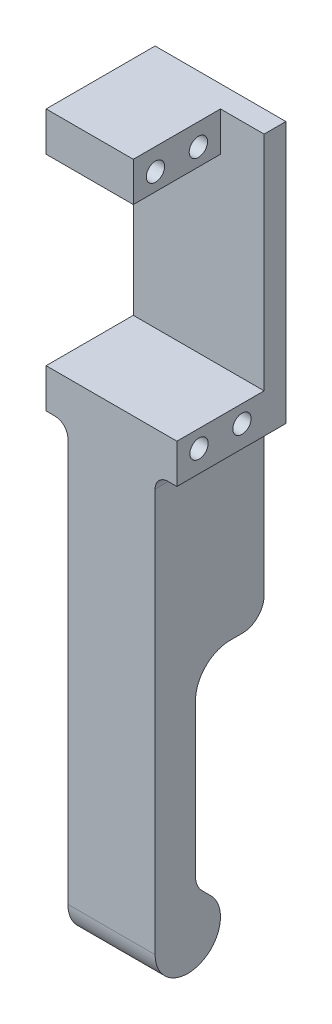
ISO-10303-21;
HEADER;
FILE_DESCRIPTION(('STEP AP214'),'2;1');
FILE_NAME('part.step','',(''),(''),'','','');
FILE_SCHEMA(('AUTOMOTIVE_DESIGN { 1 0 10303 214 1 1 1 1 }'));
ENDSEC;
DATA;
#1=APPLICATION_CONTEXT('core data for automotive mechanical design processes');
#2=APPLICATION_PROTOCOL_DEFINITION('international standard','automotive_design',2000,#1);
#3=PRODUCT_CONTEXT('',#1,'mechanical');
#4=PRODUCT('Part','Part','',(#3));
#5=PRODUCT_RELATED_PRODUCT_CATEGORY('part','',(#4));
#6=PRODUCT_DEFINITION_FORMATION('','',#4);
#7=PRODUCT_DEFINITION_CONTEXT('part definition',#1,'design');
#8=PRODUCT_DEFINITION('design','',#6,#7);
#9=PRODUCT_DEFINITION_SHAPE('','',#8);
#10=(LENGTH_UNIT() NAMED_UNIT(*) SI_UNIT(.MILLI.,.METRE.));
#11=(NAMED_UNIT(*) PLANE_ANGLE_UNIT() SI_UNIT($,.RADIAN.));
#12=(NAMED_UNIT(*) SI_UNIT($,.STERADIAN.) SOLID_ANGLE_UNIT());
#13=UNCERTAINTY_MEASURE_WITH_UNIT(LENGTH_MEASURE(1.E-05),#10,'distance_accuracy_value','');
#14=(GEOMETRIC_REPRESENTATION_CONTEXT(3) GLOBAL_UNCERTAINTY_ASSIGNED_CONTEXT((#13)) GLOBAL_UNIT_ASSIGNED_CONTEXT((#10,
#11,#12)) REPRESENTATION_CONTEXT('',''));
#15=CARTESIAN_POINT('',(0.,0.,0.));
#16=DIRECTION('',(0.,0.,1.));
#17=DIRECTION('',(1.,0.,0.));
#18=AXIS2_PLACEMENT_3D('',#15,#16,#17);
#19=CARTESIAN_POINT('',(-13.,-33.,25.0000000000009));
#20=DIRECTION('',(0.,0.,-1.));
#21=DIRECTION('',(-1.,0.,0.));
#22=AXIS2_PLACEMENT_3D('',#19,#20,#21);
#23=PLANE('',#22);
#24=DIRECTION('',(0.,-1.,0.));
#25=VECTOR('',#24,1.);
#26=CARTESIAN_POINT('',(-15.,30.,25.));
#27=LINE('',#26,#25);
#28=CARTESIAN_POINT('',(-15.,30.,25.));
#29=VERTEX_POINT('',#28);
#30=CARTESIAN_POINT('',(-14.9999999999998,21.,25.0000000000009));
#31=VERTEX_POINT('',#30);
#32=EDGE_CURVE('E446',#29,#31,#27,.T.);
#33=ORIENTED_EDGE('',*,*,#32,.T.);
#34=DIRECTION('',(-1.,0.,0.));
#35=VECTOR('',#34,1.);
#36=CARTESIAN_POINT('',(5.00000000000021,20.9999999999998,25.));
#37=LINE('',#36,#35);
#38=CARTESIAN_POINT('',(5.00000000000021,20.9999999999998,25.));
#39=VERTEX_POINT('',#38);
#40=EDGE_CURVE('E404',#39,#31,#37,.T.);
#41=ORIENTED_EDGE('',*,*,#40,.F.);
#42=DIRECTION('',(0.,-1.,0.));
#43=VECTOR('',#42,1.);
#44=CARTESIAN_POINT('',(4.99999999999999,29.9999999999998,25.0000000000009));
#45=LINE('',#44,#43);
#46=CARTESIAN_POINT('',(4.99999999999999,29.9999999999998,25.0000000000009));
#47=VERTEX_POINT('',#46);
#48=EDGE_CURVE('E425',#47,#39,#45,.T.);
#49=ORIENTED_EDGE('',*,*,#48,.F.);
#50=DIRECTION('',(-1.,0.,0.));
#51=VECTOR('',#50,1.);
#52=CARTESIAN_POINT('',(-15.,30.,25.));
#53=LINE('',#52,#51);
#54=EDGE_CURVE('E248',#47,#29,#53,.T.);
#55=ORIENTED_EDGE('',*,*,#54,.T.);
#56=EDGE_LOOP('',(#33,#41,#49,#55));
#57=FACE_BOUND('',#56,.T.);
#58=ADVANCED_FACE('F53',(#57),#23,.F.);
#59=CARTESIAN_POINT('',(-15.,30.,25.));
#60=DIRECTION('',(1.,0.,0.));
#61=DIRECTION('',(0.,1.,0.));
#62=AXIS2_PLACEMENT_3D('',#59,#60,#61);
#63=PLANE('',#62);
#64=CARTESIAN_POINT('',(-15.,-25.0000000000005,10.0749999999998));
#65=DIRECTION('',(-1.,0.,0.));
#66=DIRECTION('',(0.,1.,0.));
#67=AXIS2_PLACEMENT_3D('',#64,#65,#66);
#68=CIRCLE('',#67,2.1);
#69=CARTESIAN_POINT('',(-15.,-22.9000000000005,10.0749999999998));
#70=VERTEX_POINT('',#69);
#71=EDGE_CURVE('E376',#70,#70,#68,.T.);
#72=ORIENTED_EDGE('',*,*,#71,.F.);
#73=EDGE_LOOP('',(#72));
#74=FACE_BOUND('',#73,.T.);
#75=CARTESIAN_POINT('',(-15.,-25.0000000000001,19.9249999999999));
#76=DIRECTION('',(-1.,0.,0.));
#77=DIRECTION('',(0.,1.,0.));
#78=AXIS2_PLACEMENT_3D('',#75,#76,#77);
#79=CIRCLE('',#78,2.1);
#80=CARTESIAN_POINT('',(-15.,-22.9000000000001,19.9249999999999));
#81=VERTEX_POINT('',#80);
#82=EDGE_CURVE('E385',#81,#81,#79,.T.);
#83=ORIENTED_EDGE('',*,*,#82,.F.);
#84=EDGE_LOOP('',(#83));
#85=FACE_BOUND('',#84,.T.);
#86=CARTESIAN_POINT('',(-15.,25.,19.925));
#87=DIRECTION('',(-1.,0.,0.));
#88=DIRECTION('',(0.,-1.,0.));
#89=AXIS2_PLACEMENT_3D('',#86,#87,#88);
#90=CIRCLE('',#89,2.1);
#91=CARTESIAN_POINT('',(-15.,22.9,19.925));
#92=VERTEX_POINT('',#91);
#93=EDGE_CURVE('E377',#92,#92,#90,.T.);
#94=ORIENTED_EDGE('',*,*,#93,.F.);
#95=EDGE_LOOP('',(#94));
#96=FACE_BOUND('',#95,.T.);
#97=CARTESIAN_POINT('',(-15.,25.,10.075));
#98=DIRECTION('',(-1.,0.,0.));
#99=DIRECTION('',(0.,-1.,0.));
#100=AXIS2_PLACEMENT_3D('',#97,#98,#99);
#101=CIRCLE('',#100,2.1);
#102=CARTESIAN_POINT('',(-15.,22.9,10.075));
#103=VERTEX_POINT('',#102);
#104=EDGE_CURVE('E317',#103,#103,#101,.T.);
#105=ORIENTED_EDGE('',*,*,#104,.F.);
#106=EDGE_LOOP('',(#105));
#107=FACE_BOUND('',#106,.T.);
#108=DIRECTION('',(0.,-1.,0.));
#109=VECTOR('',#108,1.);
#110=CARTESIAN_POINT('',(-14.9999999999998,21.,5.00000000000089));
#111=LINE('',#110,#109);
#112=CARTESIAN_POINT('',(-14.9999999999998,21.,5.00000000000089));
#113=VERTEX_POINT('',#112);
#114=CARTESIAN_POINT('',(-14.9999999999998,-21.,5.));
#115=VERTEX_POINT('',#114);
#116=EDGE_CURVE('E399',#113,#115,#111,.T.);
#117=ORIENTED_EDGE('',*,*,#116,.F.);
#118=DIRECTION('',(0.,0.,1.));
#119=VECTOR('',#118,1.);
#120=CARTESIAN_POINT('',(-14.9999999999998,21.,5.00000000000089));
#121=LINE('',#120,#119);
#122=EDGE_CURVE('E257',#113,#31,#121,.T.);
#123=ORIENTED_EDGE('',*,*,#122,.T.);
#124=ORIENTED_EDGE('',*,*,#32,.F.);
#125=DIRECTION('',(0.,0.,-1.));
#126=VECTOR('',#125,1.);
#127=CARTESIAN_POINT('',(-15.,30.,25.));
#128=LINE('',#127,#126);
#129=CARTESIAN_POINT('',(-15.,30.,0.));
#130=VERTEX_POINT('',#129);
#131=EDGE_CURVE('E251',#29,#130,#128,.T.);
#132=ORIENTED_EDGE('',*,*,#131,.T.);
#133=DIRECTION('',(0.,-1.,0.));
#134=VECTOR('',#133,1.);
#135=CARTESIAN_POINT('',(-15.,30.,0.));
#136=LINE('',#135,#134);
#137=CARTESIAN_POINT('',(-15.,-30.,0.));
#138=VERTEX_POINT('',#137);
#139=EDGE_CURVE('E252',#130,#138,#136,.T.);
#140=ORIENTED_EDGE('',*,*,#139,.T.);
#141=DIRECTION('',(0.,0.,-1.));
#142=VECTOR('',#141,1.);
#143=CARTESIAN_POINT('',(-14.9999999999998,-30.,25.));
#144=LINE('',#143,#142);
#145=CARTESIAN_POINT('',(-14.9999999999998,-30.,25.));
#146=VERTEX_POINT('',#145);
#147=EDGE_CURVE('E308',#146,#138,#144,.T.);
#148=ORIENTED_EDGE('',*,*,#147,.F.);
#149=CARTESIAN_POINT('',(-14.9999999999998,-21.,25.));
#150=VERTEX_POINT('',#149);
#151=EDGE_CURVE('E282',#150,#146,#27,.T.);
#152=ORIENTED_EDGE('',*,*,#151,.F.);
#153=DIRECTION('',(0.,0.,1.));
#154=VECTOR('',#153,1.);
#155=CARTESIAN_POINT('',(-14.9999999999998,-21.,5.));
#156=LINE('',#155,#154);
#157=EDGE_CURVE('E77',#115,#150,#156,.T.);
#158=ORIENTED_EDGE('',*,*,#157,.F.);
#159=EDGE_LOOP('',(#117,#123,#124,#132,#140,#148,#152,#158));
#160=FACE_BOUND('',#159,.T.);
#161=ADVANCED_FACE('F55',(#74,#85,#96,#107,#160),#63,.F.);
#162=CARTESIAN_POINT('',(-14.9999999999998,-30.,25.));
#163=DIRECTION('',(0.,1.,0.));
#164=DIRECTION('',(0.,0.,1.));
#165=AXIS2_PLACEMENT_3D('',#162,#163,#164);
#166=PLANE('',#165);
#167=DIRECTION('',(1.,0.,0.));
#168=VECTOR('',#167,1.);
#169=CARTESIAN_POINT('',(-15.,-30.,0.));
#170=LINE('',#169,#168);
#171=CARTESIAN_POINT('',(-13.,-30.,0.));
#172=VERTEX_POINT('',#171);
#173=EDGE_CURVE('E256',#138,#172,#170,.T.);
#174=ORIENTED_EDGE('',*,*,#173,.T.);
#175=DIRECTION('',(0.,0.,-1.));
#176=VECTOR('',#175,1.);
#177=CARTESIAN_POINT('',(-12.9999999999998,-30.0000000000004,25.));
#178=LINE('',#177,#176);
#179=CARTESIAN_POINT('',(-12.9999999999998,-30.0000000000004,25.));
#180=VERTEX_POINT('',#179);
#181=EDGE_CURVE('E304',#180,#172,#178,.T.);
#182=ORIENTED_EDGE('',*,*,#181,.F.);
#183=DIRECTION('',(1.,0.,0.));
#184=VECTOR('',#183,1.);
#185=CARTESIAN_POINT('',(-14.9999999999998,-30.,25.));
#186=LINE('',#185,#184);
#187=EDGE_CURVE('E235',#146,#180,#186,.T.);
#188=ORIENTED_EDGE('',*,*,#187,.F.);
#189=ORIENTED_EDGE('',*,*,#147,.T.);
#190=EDGE_LOOP('',(#174,#182,#188,#189));
#191=FACE_BOUND('',#190,.T.);
#192=ADVANCED_FACE('F456',(#191),#166,.F.);
#193=CARTESIAN_POINT('',(-13.,-33.,25.0000000000009));
#194=DIRECTION('',(0.,0.,-1.));
#195=DIRECTION('',(-1.,0.,0.));
#196=AXIS2_PLACEMENT_3D('',#193,#194,#195);
#197=CYLINDRICAL_SURFACE('',#196,3.);
#198=CARTESIAN_POINT('',(-13.,-33.,8.88178419700125E-13));
#199=DIRECTION('',(0.,0.,-1.));
#200=DIRECTION('',(-1.,0.,0.));
#201=AXIS2_PLACEMENT_3D('',#198,#199,#200);
#202=CIRCLE('',#201,3.);
#203=CARTESIAN_POINT('',(-9.99999999999999,-33.,8.88178419700125E-13));
#204=VERTEX_POINT('',#203);
#205=EDGE_CURVE('E260',#172,#204,#202,.T.);
#206=ORIENTED_EDGE('',*,*,#205,.T.);
#207=DIRECTION('',(0.,0.,-1.));
#208=VECTOR('',#207,1.);
#209=CARTESIAN_POINT('',(-9.99999999999999,-33.,25.0000000000009));
#210=LINE('',#209,#208);
#211=CARTESIAN_POINT('',(-9.99999999999999,-33.,25.0000000000009));
#212=VERTEX_POINT('',#211);
#213=EDGE_CURVE('E301',#212,#204,#210,.T.);
#214=ORIENTED_EDGE('',*,*,#213,.F.);
#215=CARTESIAN_POINT('',(-13.,-33.,25.0000000000009));
#216=DIRECTION('',(0.,0.,-1.));
#217=DIRECTION('',(-1.,0.,0.));
#218=AXIS2_PLACEMENT_3D('',#215,#216,#217);
#219=CIRCLE('',#218,3.);
#220=EDGE_CURVE('E225',#180,#212,#219,.T.);
#221=ORIENTED_EDGE('',*,*,#220,.F.);
#222=ORIENTED_EDGE('',*,*,#181,.T.);
#223=EDGE_LOOP('',(#206,#214,#221,#222));
#224=FACE_BOUND('',#223,.T.);
#225=ADVANCED_FACE('F459',(#224),#197,.F.);
#226=CARTESIAN_POINT('',(-9.99999999999977,-133.,25.));
#227=DIRECTION('',(1.,0.,0.));
#228=DIRECTION('',(0.,0.,-1.));
#229=AXIS2_PLACEMENT_3D('',#226,#227,#228);
#230=PLANE('',#229);
#231=DIRECTION('',(0.,-1.,0.));
#232=VECTOR('',#231,1.);
#233=CARTESIAN_POINT('',(-9.99999999999977,-133.000000000002,0.));
#234=LINE('',#233,#232);
#235=CARTESIAN_POINT('',(-9.99999999999999,-66.6611652351682,8.88178419700125E-13));
#236=VERTEX_POINT('',#235);
#237=EDGE_CURVE('E263',#204,#236,#234,.T.);
#238=ORIENTED_EDGE('',*,*,#237,.T.);
#239=CARTESIAN_POINT('',(-9.99999999999977,-66.6611652351682,5.00000000000078));
#240=DIRECTION('',(1.,0.,0.));
#241=DIRECTION('',(0.,0.,-1.));
#242=AXIS2_PLACEMENT_3D('',#239,#240,#241);
#243=CIRCLE('',#242,5.);
#244=CARTESIAN_POINT('',(-9.99999999999977,-71.6611652351682,5.00000000000084));
#245=VERTEX_POINT('',#244);
#246=EDGE_CURVE('E69',#245,#236,#243,.T.);
#247=ORIENTED_EDGE('',*,*,#246,.F.);
#248=DIRECTION('',(0.,0.,-1.));
#249=VECTOR('',#248,1.);
#250=CARTESIAN_POINT('',(-9.99999999999977,-71.6611652351682,5.00000000000084));
#251=LINE('',#250,#249);
#252=CARTESIAN_POINT('',(-9.99999999999999,-71.6611652351682,7.73223304703441));
#253=VERTEX_POINT('',#252);
#254=EDGE_CURVE('E499',#253,#245,#251,.T.);
#255=ORIENTED_EDGE('',*,*,#254,.F.);
#256=CARTESIAN_POINT('',(-9.99999999999999,-79.6611652351682,7.73223304703441));
#257=DIRECTION('',(-1.,0.,0.));
#258=DIRECTION('',(0.,0.,1.));
#259=AXIS2_PLACEMENT_3D('',#256,#257,#258);
#260=CIRCLE('',#259,8.);
#261=CARTESIAN_POINT('',(-9.99999999999999,-79.6611652351682,15.7322330470344));
#262=VERTEX_POINT('',#261);
#263=EDGE_CURVE('E494',#262,#253,#260,.T.);
#264=ORIENTED_EDGE('',*,*,#263,.F.);
#265=DIRECTION('',(0.,1.,0.));
#266=VECTOR('',#265,1.);
#267=CARTESIAN_POINT('',(-9.99999999999999,-79.6611652351682,15.7322330470344));
#268=LINE('',#267,#266);
#269=CARTESIAN_POINT('',(-10.,-114.590097423303,15.7322330470344));
#270=VERTEX_POINT('',#269);
#271=EDGE_CURVE('E352',#270,#262,#268,.T.);
#272=ORIENTED_EDGE('',*,*,#271,.F.);
#273=CARTESIAN_POINT('',(-9.99999999999999,-114.590097423303,10.7322330470344));
#274=DIRECTION('',(-1.,0.,0.));
#275=DIRECTION('',(0.,0.,1.));
#276=AXIS2_PLACEMENT_3D('',#273,#274,#275);
#277=CIRCLE('',#276,5.);
#278=CARTESIAN_POINT('',(-9.99999999999998,-118.125631329236,14.2677669529663));
#279=VERTEX_POINT('',#278);
#280=EDGE_CURVE('E490',#279,#270,#277,.T.);
#281=ORIENTED_EDGE('',*,*,#280,.F.);
#282=DIRECTION('',(0.,0.707106781186548,0.707106781186547));
#283=VECTOR('',#282,1.);
#284=CARTESIAN_POINT('',(-9.99999999999999,-120.196699141101,12.1966991411017));
#285=LINE('',#284,#283);
#286=CARTESIAN_POINT('',(-9.99999999999999,-120.196699141101,12.1966991411017));
#287=VERTEX_POINT('',#286);
#288=EDGE_CURVE('E207',#287,#279,#285,.T.);
#289=ORIENTED_EDGE('',*,*,#288,.F.);
#290=CARTESIAN_POINT('',(-9.99999999999999,-125.5,17.5));
#291=DIRECTION('',(1.,0.,0.));
#292=DIRECTION('',(0.,0.,1.));
#293=AXIS2_PLACEMENT_3D('',#290,#291,#292);
#294=CIRCLE('',#293,7.5);
#295=CARTESIAN_POINT('',(-9.99999999999977,-125.5,24.9999999999999));
#296=VERTEX_POINT('',#295);
#297=EDGE_CURVE('E198',#296,#287,#294,.T.);
#298=ORIENTED_EDGE('',*,*,#297,.F.);
#299=DIRECTION('',(0.,-1.,0.));
#300=VECTOR('',#299,1.);
#301=CARTESIAN_POINT('',(-9.99999999999977,-133.,25.));
#302=LINE('',#301,#300);
#303=EDGE_CURVE('E204',#212,#296,#302,.T.);
#304=ORIENTED_EDGE('',*,*,#303,.F.);
#305=ORIENTED_EDGE('',*,*,#213,.T.);
#306=EDGE_LOOP('',(#238,#247,#255,#264,#272,#281,#289,#298,#304,#305));
#307=FACE_BOUND('',#306,.T.);
#308=ADVANCED_FACE('F201',(#307),#230,.F.);
#309=CARTESIAN_POINT('',(9.99999999999999,-33.,25.));
#310=DIRECTION('',(-1.,0.,0.));
#311=DIRECTION('',(0.,-1.,0.));
#312=AXIS2_PLACEMENT_3D('',#309,#310,#311);
#313=PLANE('',#312);
#314=DIRECTION('',(0.,0.,-1.));
#315=VECTOR('',#314,1.);
#316=CARTESIAN_POINT('',(10.0000000000002,-71.6611652351682,25.));
#317=LINE('',#316,#315);
#318=CARTESIAN_POINT('',(10.,-71.6611652351682,7.73223304703352));
#319=VERTEX_POINT('',#318);
#320=CARTESIAN_POINT('',(10.0000000000002,-71.6611652351682,4.99999999999995));
#321=VERTEX_POINT('',#320);
#322=EDGE_CURVE('E13',#319,#321,#317,.T.);
#323=ORIENTED_EDGE('',*,*,#322,.T.);
#324=CARTESIAN_POINT('',(10.0000000000002,-66.6611652351682,4.99999999999989));
#325=DIRECTION('',(-1.,0.,0.));
#326=DIRECTION('',(0.,-1.,0.));
#327=AXIS2_PLACEMENT_3D('',#324,#325,#326);
#328=CIRCLE('',#327,5.);
#329=CARTESIAN_POINT('',(10.,-66.6611652351682,-1.11022302462516E-13));
#330=VERTEX_POINT('',#329);
#331=EDGE_CURVE('E371',#321,#330,#328,.F.);
#332=ORIENTED_EDGE('',*,*,#331,.T.);
#333=DIRECTION('',(0.,1.,0.));
#334=VECTOR('',#333,1.);
#335=CARTESIAN_POINT('',(9.99999999999999,-33.,0.));
#336=LINE('',#335,#334);
#337=CARTESIAN_POINT('',(9.99999999999998,-33.,0.));
#338=VERTEX_POINT('',#337);
#339=EDGE_CURVE('E266',#330,#338,#336,.T.);
#340=ORIENTED_EDGE('',*,*,#339,.T.);
#341=DIRECTION('',(0.,0.,-1.));
#342=VECTOR('',#341,1.);
#343=CARTESIAN_POINT('',(9.99999999999999,-33.,25.));
#344=LINE('',#343,#342);
#345=CARTESIAN_POINT('',(9.99999999999999,-33.,25.));
#346=VERTEX_POINT('',#345);
#347=EDGE_CURVE('E297',#346,#338,#344,.T.);
#348=ORIENTED_EDGE('',*,*,#347,.F.);
#349=DIRECTION('',(0.,1.,0.));
#350=VECTOR('',#349,1.);
#351=CARTESIAN_POINT('',(10.0000000000002,-61.,25.));
#352=LINE('',#351,#350);
#353=CARTESIAN_POINT('',(10.0000000000002,-125.5,24.9999999999999));
#354=VERTEX_POINT('',#353);
#355=EDGE_CURVE('E228',#354,#346,#352,.T.);
#356=ORIENTED_EDGE('',*,*,#355,.F.);
#357=CARTESIAN_POINT('',(10.,-125.5,17.5));
#358=DIRECTION('',(-1.,0.,0.));
#359=DIRECTION('',(0.,-1.,0.));
#360=AXIS2_PLACEMENT_3D('',#357,#358,#359);
#361=CIRCLE('',#360,7.5);
#362=CARTESIAN_POINT('',(10.,-120.196699141101,12.1966991411008));
#363=VERTEX_POINT('',#362);
#364=EDGE_CURVE('E216',#354,#363,#361,.F.);
#365=ORIENTED_EDGE('',*,*,#364,.T.);
#366=DIRECTION('',(0.,0.707106781186548,0.707106781186547));
#367=VECTOR('',#366,1.);
#368=CARTESIAN_POINT('',(10.0000000000002,-70.1966991411008,62.1966991411024));
#369=LINE('',#368,#367);
#370=CARTESIAN_POINT('',(10.,-118.125631329235,14.2677669529663));
#371=VERTEX_POINT('',#370);
#372=EDGE_CURVE('E220',#363,#371,#369,.T.);
#373=ORIENTED_EDGE('',*,*,#372,.T.);
#374=CARTESIAN_POINT('',(10.,-114.590097423303,10.7322330470335));
#375=DIRECTION('',(-1.,0.,0.));
#376=DIRECTION('',(0.,-1.,0.));
#377=AXIS2_PLACEMENT_3D('',#374,#375,#376);
#378=CIRCLE('',#377,5.);
#379=CARTESIAN_POINT('',(10.,-114.590097423303,15.7322330470335));
#380=VERTEX_POINT('',#379);
#381=EDGE_CURVE('E327',#371,#380,#378,.T.);
#382=ORIENTED_EDGE('',*,*,#381,.T.);
#383=DIRECTION('',(0.,1.,0.));
#384=VECTOR('',#383,1.);
#385=CARTESIAN_POINT('',(9.99999999999999,-33.0000000000004,15.7322330470335));
#386=LINE('',#385,#384);
#387=CARTESIAN_POINT('',(10.,-79.6611652351682,15.7322330470335));
#388=VERTEX_POINT('',#387);
#389=EDGE_CURVE('E331',#380,#388,#386,.T.);
#390=ORIENTED_EDGE('',*,*,#389,.T.);
#391=CARTESIAN_POINT('',(10.,-79.6611652351682,7.73223304703352));
#392=DIRECTION('',(-1.,0.,0.));
#393=DIRECTION('',(0.,-1.,0.));
#394=AXIS2_PLACEMENT_3D('',#391,#392,#393);
#395=CIRCLE('',#394,8.);
#396=EDGE_CURVE('E62',#388,#319,#395,.T.);
#397=ORIENTED_EDGE('',*,*,#396,.T.);
#398=EDGE_LOOP('',(#323,#332,#340,#348,#356,#365,#373,#382,#390,#397));
#399=FACE_BOUND('',#398,.T.);
#400=ADVANCED_FACE('F338',(#399),#313,.F.);
#401=CARTESIAN_POINT('',(13.,-33.,25.));
#402=DIRECTION('',(0.,0.,-1.));
#403=DIRECTION('',(-1.,0.,0.));
#404=AXIS2_PLACEMENT_3D('',#401,#402,#403);
#405=CYLINDRICAL_SURFACE('',#404,3.);
#406=CARTESIAN_POINT('',(13.,-33.,8.88178419700125E-13));
#407=DIRECTION('',(0.,0.,-1.));
#408=DIRECTION('',(1.,0.,0.));
#409=AXIS2_PLACEMENT_3D('',#406,#407,#408);
#410=CIRCLE('',#409,3.);
#411=CARTESIAN_POINT('',(13.,-30.,0.));
#412=VERTEX_POINT('',#411);
#413=EDGE_CURVE('E269',#338,#412,#410,.T.);
#414=ORIENTED_EDGE('',*,*,#413,.T.);
#415=DIRECTION('',(0.,0.,-1.));
#416=VECTOR('',#415,1.);
#417=CARTESIAN_POINT('',(13.0000000000002,-30.,25.));
#418=LINE('',#417,#416);
#419=CARTESIAN_POINT('',(13.0000000000002,-30.,25.));
#420=VERTEX_POINT('',#419);
#421=EDGE_CURVE('E293',#420,#412,#418,.T.);
#422=ORIENTED_EDGE('',*,*,#421,.F.);
#423=CARTESIAN_POINT('',(13.,-33.,25.));
#424=DIRECTION('',(0.,0.,-1.));
#425=DIRECTION('',(1.,0.,0.));
#426=AXIS2_PLACEMENT_3D('',#423,#424,#425);
#427=CIRCLE('',#426,3.);
#428=EDGE_CURVE('E233',#346,#420,#427,.T.);
#429=ORIENTED_EDGE('',*,*,#428,.F.);
#430=ORIENTED_EDGE('',*,*,#347,.T.);
#431=EDGE_LOOP('',(#414,#422,#429,#430));
#432=FACE_BOUND('',#431,.T.);
#433=ADVANCED_FACE('F470',(#432),#405,.F.);
#434=CARTESIAN_POINT('',(15.0000000000002,-30.,25.0000000000009));
#435=DIRECTION('',(0.,1.,0.));
#436=DIRECTION('',(0.,0.,1.));
#437=AXIS2_PLACEMENT_3D('',#434,#435,#436);
#438=PLANE('',#437);
#439=DIRECTION('',(1.,0.,0.));
#440=VECTOR('',#439,1.);
#441=CARTESIAN_POINT('',(15.,-30.,8.88178419700125E-13));
#442=LINE('',#441,#440);
#443=CARTESIAN_POINT('',(15.,-30.,8.88178419700125E-13));
#444=VERTEX_POINT('',#443);
#445=EDGE_CURVE('E272',#412,#444,#442,.T.);
#446=ORIENTED_EDGE('',*,*,#445,.T.);
#447=DIRECTION('',(0.,0.,-1.));
#448=VECTOR('',#447,1.);
#449=CARTESIAN_POINT('',(15.0000000000002,-30.,25.0000000000009));
#450=LINE('',#449,#448);
#451=CARTESIAN_POINT('',(15.0000000000002,-30.,25.0000000000009));
#452=VERTEX_POINT('',#451);
#453=EDGE_CURVE('E289',#452,#444,#450,.T.);
#454=ORIENTED_EDGE('',*,*,#453,.F.);
#455=DIRECTION('',(1.,0.,0.));
#456=VECTOR('',#455,1.);
#457=CARTESIAN_POINT('',(15.0000000000002,-30.,25.0000000000009));
#458=LINE('',#457,#456);
#459=EDGE_CURVE('E241',#420,#452,#458,.T.);
#460=ORIENTED_EDGE('',*,*,#459,.F.);
#461=ORIENTED_EDGE('',*,*,#421,.T.);
#462=EDGE_LOOP('',(#446,#454,#460,#461));
#463=FACE_BOUND('',#462,.T.);
#464=ADVANCED_FACE('F477',(#463),#438,.F.);
#465=CARTESIAN_POINT('',(15.,29.9999999999998,25.));
#466=DIRECTION('',(-1.,0.,0.));
#467=DIRECTION('',(0.,-1.,0.));
#468=AXIS2_PLACEMENT_3D('',#465,#466,#467);
#469=PLANE('',#468);
#470=CARTESIAN_POINT('',(15.,-25.,10.0750000000007));
#471=DIRECTION('',(-1.,0.,0.));
#472=DIRECTION('',(0.,1.,0.));
#473=AXIS2_PLACEMENT_3D('',#470,#471,#472);
#474=CIRCLE('',#473,2.1);
#475=CARTESIAN_POINT('',(15.,-22.9,10.0750000000007));
#476=VERTEX_POINT('',#475);
#477=EDGE_CURVE('E389',#476,#476,#474,.T.);
#478=ORIENTED_EDGE('',*,*,#477,.T.);
#479=EDGE_LOOP('',(#478));
#480=FACE_BOUND('',#479,.T.);
#481=CARTESIAN_POINT('',(15.,-25.0000000000001,19.9250000000007));
#482=DIRECTION('',(-1.,0.,0.));
#483=DIRECTION('',(0.,1.,0.));
#484=AXIS2_PLACEMENT_3D('',#481,#482,#483);
#485=CIRCLE('',#484,2.1);
#486=CARTESIAN_POINT('',(15.,-22.9000000000001,19.9250000000007));
#487=VERTEX_POINT('',#486);
#488=EDGE_CURVE('E381',#487,#487,#485,.T.);
#489=ORIENTED_EDGE('',*,*,#488,.T.);
#490=EDGE_LOOP('',(#489));
#491=FACE_BOUND('',#490,.T.);
#492=DIRECTION('',(0.,1.,0.));
#493=VECTOR('',#492,1.);
#494=CARTESIAN_POINT('',(15.0000000000002,-21.,5.));
#495=LINE('',#494,#493);
#496=CARTESIAN_POINT('',(15.0000000000002,-21.,5.));
#497=VERTEX_POINT('',#496);
#498=CARTESIAN_POINT('',(15.,30.,5.));
#499=VERTEX_POINT('',#498);
#500=EDGE_CURVE('E408',#497,#499,#495,.T.);
#501=ORIENTED_EDGE('',*,*,#500,.F.);
#502=DIRECTION('',(0.,0.,1.));
#503=VECTOR('',#502,1.);
#504=CARTESIAN_POINT('',(15.0000000000002,-21.,5.));
#505=LINE('',#504,#503);
#506=CARTESIAN_POINT('',(15.0000000000002,-21.,25.));
#507=VERTEX_POINT('',#506);
#508=EDGE_CURVE('E440',#497,#507,#505,.T.);
#509=ORIENTED_EDGE('',*,*,#508,.T.);
#510=DIRECTION('',(0.,1.,0.));
#511=VECTOR('',#510,1.);
#512=CARTESIAN_POINT('',(15.,29.9999999999998,25.));
#513=LINE('',#512,#511);
#514=EDGE_CURVE('E244',#452,#507,#513,.T.);
#515=ORIENTED_EDGE('',*,*,#514,.F.);
#516=ORIENTED_EDGE('',*,*,#453,.T.);
#517=DIRECTION('',(0.,1.,0.));
#518=VECTOR('',#517,1.);
#519=CARTESIAN_POINT('',(15.,30.,0.));
#520=LINE('',#519,#518);
#521=CARTESIAN_POINT('',(15.,30.,0.));
#522=VERTEX_POINT('',#521);
#523=EDGE_CURVE('E275',#444,#522,#520,.T.);
#524=ORIENTED_EDGE('',*,*,#523,.T.);
#525=DIRECTION('',(0.,0.,-1.));
#526=VECTOR('',#525,1.);
#527=CARTESIAN_POINT('',(15.,29.9999999999998,25.));
#528=LINE('',#527,#526);
#529=EDGE_CURVE('E286',#499,#522,#528,.T.);
#530=ORIENTED_EDGE('',*,*,#529,.F.);
#531=EDGE_LOOP('',(#501,#509,#515,#516,#524,#530));
#532=FACE_BOUND('',#531,.T.);
#533=ADVANCED_FACE('F482',(#480,#491,#532),#469,.F.);
#534=CARTESIAN_POINT('',(-15.,30.,25.));
#535=DIRECTION('',(0.,-1.,0.));
#536=DIRECTION('',(0.,0.,-1.));
#537=AXIS2_PLACEMENT_3D('',#534,#535,#536);
#538=PLANE('',#537);
#539=ORIENTED_EDGE('',*,*,#54,.F.);
#540=DIRECTION('',(0.,0.,1.));
#541=VECTOR('',#540,1.);
#542=CARTESIAN_POINT('',(4.99999999999999,30.,5.00000000000089));
#543=LINE('',#542,#541);
#544=CARTESIAN_POINT('',(4.99999999999999,30.,5.00000000000089));
#545=VERTEX_POINT('',#544);
#546=EDGE_CURVE('E437',#545,#47,#543,.T.);
#547=ORIENTED_EDGE('',*,*,#546,.F.);
#548=DIRECTION('',(-1.,0.,0.));
#549=VECTOR('',#548,1.);
#550=CARTESIAN_POINT('',(15.,30.,5.));
#551=LINE('',#550,#549);
#552=EDGE_CURVE('E411',#499,#545,#551,.T.);
#553=ORIENTED_EDGE('',*,*,#552,.F.);
#554=ORIENTED_EDGE('',*,*,#529,.T.);
#555=DIRECTION('',(-1.,0.,0.));
#556=VECTOR('',#555,1.);
#557=CARTESIAN_POINT('',(-15.,30.,0.));
#558=LINE('',#557,#556);
#559=EDGE_CURVE('E279',#522,#130,#558,.T.);
#560=ORIENTED_EDGE('',*,*,#559,.T.);
#561=ORIENTED_EDGE('',*,*,#131,.F.);
#562=EDGE_LOOP('',(#539,#547,#553,#554,#560,#561));
#563=FACE_BOUND('',#562,.T.);
#564=ADVANCED_FACE('F533',(#563),#538,.F.);
#565=ORIENTED_EDGE('',*,*,#303,.T.);
#566=DIRECTION('',(-1.,0.,0.));
#567=VECTOR('',#566,1.);
#568=CARTESIAN_POINT('',(15.0000000000002,-125.5,25.));
#569=LINE('',#568,#567);
#570=EDGE_CURVE('E213',#296,#354,#569,.F.);
#571=ORIENTED_EDGE('',*,*,#570,.T.);
#572=ORIENTED_EDGE('',*,*,#355,.T.);
#573=ORIENTED_EDGE('',*,*,#428,.T.);
#574=ORIENTED_EDGE('',*,*,#459,.T.);
#575=ORIENTED_EDGE('',*,*,#514,.T.);
#576=DIRECTION('',(1.,0.,0.));
#577=VECTOR('',#576,1.);
#578=CARTESIAN_POINT('',(-14.9999999999998,-21.,25.));
#579=LINE('',#578,#577);
#580=EDGE_CURVE('E321',#150,#507,#579,.T.);
#581=ORIENTED_EDGE('',*,*,#580,.F.);
#582=ORIENTED_EDGE('',*,*,#151,.T.);
#583=ORIENTED_EDGE('',*,*,#187,.T.);
#584=ORIENTED_EDGE('',*,*,#220,.T.);
#585=EDGE_LOOP('',(#565,#571,#572,#573,#574,#575,#581,#582,#583,#584));
#586=FACE_BOUND('',#585,.T.);
#587=ADVANCED_FACE('F223',(#586),#23,.F.);
#588=CARTESIAN_POINT('',(-13.,-33.,8.88178419700125E-13));
#589=DIRECTION('',(0.,0.,-1.));
#590=DIRECTION('',(-1.,0.,0.));
#591=AXIS2_PLACEMENT_3D('',#588,#589,#590);
#592=PLANE('',#591);
#593=DIRECTION('',(-1.,0.,0.));
#594=VECTOR('',#593,1.);
#595=CARTESIAN_POINT('',(15.,-66.6611652351681,8.32667268468867E-13));
#596=LINE('',#595,#594);
#597=EDGE_CURVE('E221',#236,#330,#596,.F.);
#598=ORIENTED_EDGE('',*,*,#597,.F.);
#599=ORIENTED_EDGE('',*,*,#237,.F.);
#600=ORIENTED_EDGE('',*,*,#205,.F.);
#601=ORIENTED_EDGE('',*,*,#173,.F.);
#602=ORIENTED_EDGE('',*,*,#139,.F.);
#603=ORIENTED_EDGE('',*,*,#559,.F.);
#604=ORIENTED_EDGE('',*,*,#523,.F.);
#605=ORIENTED_EDGE('',*,*,#445,.F.);
#606=ORIENTED_EDGE('',*,*,#413,.F.);
#607=ORIENTED_EDGE('',*,*,#339,.F.);
#608=EDGE_LOOP('',(#598,#599,#600,#601,#602,#603,#604,#605,#606,#607));
#609=FACE_BOUND('',#608,.T.);
#610=ADVANCED_FACE('F462',(#609),#592,.T.);
#611=CARTESIAN_POINT('',(5.00000000000021,21.,5.));
#612=DIRECTION('',(0.,1.,0.));
#613=DIRECTION('',(0.,0.,1.));
#614=AXIS2_PLACEMENT_3D('',#611,#612,#613);
#615=PLANE('',#614);
#616=ORIENTED_EDGE('',*,*,#40,.T.);
#617=ORIENTED_EDGE('',*,*,#122,.F.);
#618=DIRECTION('',(-1.,0.,0.));
#619=VECTOR('',#618,1.);
#620=CARTESIAN_POINT('',(5.00000000000021,21.,5.));
#621=LINE('',#620,#619);
#622=CARTESIAN_POINT('',(5.00000000000021,21.,5.));
#623=VERTEX_POINT('',#622);
#624=EDGE_CURVE('E419',#623,#113,#621,.T.);
#625=ORIENTED_EDGE('',*,*,#624,.F.);
#626=DIRECTION('',(0.,0.,1.));
#627=VECTOR('',#626,1.);
#628=CARTESIAN_POINT('',(5.00000000000021,21.,5.));
#629=LINE('',#628,#627);
#630=EDGE_CURVE('E434',#623,#39,#629,.T.);
#631=ORIENTED_EDGE('',*,*,#630,.T.);
#632=EDGE_LOOP('',(#616,#617,#625,#631));
#633=FACE_BOUND('',#632,.T.);
#634=ADVANCED_FACE('F538',(#633),#615,.F.);
#635=CARTESIAN_POINT('',(4.99999999999999,30.,5.00000000000089));
#636=DIRECTION('',(-1.,0.,0.));
#637=DIRECTION('',(0.,-1.,0.));
#638=AXIS2_PLACEMENT_3D('',#635,#636,#637);
#639=PLANE('',#638);
#640=CARTESIAN_POINT('',(4.99999999999999,24.9999999999998,19.9250000000009));
#641=DIRECTION('',(-1.,0.,0.));
#642=DIRECTION('',(0.,-1.,0.));
#643=AXIS2_PLACEMENT_3D('',#640,#641,#642);
#644=CIRCLE('',#643,2.1);
#645=CARTESIAN_POINT('',(4.99999999999999,22.8999999999998,19.9250000000009));
#646=VERTEX_POINT('',#645);
#647=EDGE_CURVE('E316',#646,#646,#644,.T.);
#648=ORIENTED_EDGE('',*,*,#647,.T.);
#649=EDGE_LOOP('',(#648));
#650=FACE_BOUND('',#649,.T.);
#651=CARTESIAN_POINT('',(4.99999999999999,24.9999999999998,10.0750000000009));
#652=DIRECTION('',(-1.,0.,0.));
#653=DIRECTION('',(0.,-1.,0.));
#654=AXIS2_PLACEMENT_3D('',#651,#652,#653);
#655=CIRCLE('',#654,2.1);
#656=CARTESIAN_POINT('',(4.99999999999999,22.8999999999998,10.0750000000009));
#657=VERTEX_POINT('',#656);
#658=EDGE_CURVE('E312',#657,#657,#655,.T.);
#659=ORIENTED_EDGE('',*,*,#658,.T.);
#660=EDGE_LOOP('',(#659));
#661=FACE_BOUND('',#660,.T.);
#662=ORIENTED_EDGE('',*,*,#48,.T.);
#663=ORIENTED_EDGE('',*,*,#630,.F.);
#664=DIRECTION('',(0.,-1.,0.));
#665=VECTOR('',#664,1.);
#666=CARTESIAN_POINT('',(4.99999999999999,30.,5.00000000000089));
#667=LINE('',#666,#665);
#668=EDGE_CURVE('E415',#545,#623,#667,.T.);
#669=ORIENTED_EDGE('',*,*,#668,.F.);
#670=ORIENTED_EDGE('',*,*,#546,.T.);
#671=EDGE_LOOP('',(#662,#663,#669,#670));
#672=FACE_BOUND('',#671,.T.);
#673=ADVANCED_FACE('F610',(#650,#661,#672),#639,.F.);
#674=CARTESIAN_POINT('',(-14.9999999999998,-21.,5.));
#675=DIRECTION('',(0.,-1.,0.));
#676=DIRECTION('',(0.,0.,-1.));
#677=AXIS2_PLACEMENT_3D('',#674,#675,#676);
#678=PLANE('',#677);
#679=ORIENTED_EDGE('',*,*,#580,.T.);
#680=ORIENTED_EDGE('',*,*,#508,.F.);
#681=DIRECTION('',(1.,0.,0.));
#682=VECTOR('',#681,1.);
#683=CARTESIAN_POINT('',(-14.9999999999998,-21.,5.));
#684=LINE('',#683,#682);
#685=EDGE_CURVE('E403',#115,#497,#684,.T.);
#686=ORIENTED_EDGE('',*,*,#685,.F.);
#687=ORIENTED_EDGE('',*,*,#157,.T.);
#688=EDGE_LOOP('',(#679,#680,#686,#687));
#689=FACE_BOUND('',#688,.T.);
#690=ADVANCED_FACE('F620',(#689),#678,.F.);
#691=CARTESIAN_POINT('',(0.,0.,5.));
#692=DIRECTION('',(0.,0.,1.));
#693=DIRECTION('',(1.,0.,0.));
#694=AXIS2_PLACEMENT_3D('',#691,#692,#693);
#695=PLANE('',#694);
#696=ORIENTED_EDGE('',*,*,#116,.T.);
#697=ORIENTED_EDGE('',*,*,#685,.T.);
#698=ORIENTED_EDGE('',*,*,#500,.T.);
#699=ORIENTED_EDGE('',*,*,#552,.T.);
#700=ORIENTED_EDGE('',*,*,#668,.T.);
#701=ORIENTED_EDGE('',*,*,#624,.T.);
#702=EDGE_LOOP('',(#696,#697,#698,#699,#700,#701));
#703=FACE_BOUND('',#702,.T.);
#704=ADVANCED_FACE('F630',(#703),#695,.T.);
#705=CARTESIAN_POINT('',(15.,24.9999999999998,10.075));
#706=DIRECTION('',(-1.,0.,0.));
#707=DIRECTION('',(0.,-1.,0.));
#708=AXIS2_PLACEMENT_3D('',#705,#706,#707);
#709=CYLINDRICAL_SURFACE('',#708,2.1);
#710=ORIENTED_EDGE('',*,*,#104,.T.);
#711=EDGE_LOOP('',(#710));
#712=FACE_BOUND('',#711,.T.);
#713=ORIENTED_EDGE('',*,*,#658,.F.);
#714=EDGE_LOOP('',(#713));
#715=FACE_BOUND('',#714,.T.);
#716=ADVANCED_FACE('F638',(#712,#715),#709,.F.);
#717=CARTESIAN_POINT('',(15.,24.9999999999998,19.925));
#718=DIRECTION('',(-1.,0.,0.));
#719=DIRECTION('',(0.,-1.,0.));
#720=AXIS2_PLACEMENT_3D('',#717,#718,#719);
#721=CYLINDRICAL_SURFACE('',#720,2.1);
#722=ORIENTED_EDGE('',*,*,#93,.T.);
#723=EDGE_LOOP('',(#722));
#724=FACE_BOUND('',#723,.T.);
#725=ORIENTED_EDGE('',*,*,#647,.F.);
#726=EDGE_LOOP('',(#725));
#727=FACE_BOUND('',#726,.T.);
#728=ADVANCED_FACE('F648',(#724,#727),#721,.F.);
#729=CARTESIAN_POINT('',(15.,-25.0000000000001,19.9250000000007));
#730=DIRECTION('',(-1.,0.,0.));
#731=DIRECTION('',(0.,-1.,0.));
#732=AXIS2_PLACEMENT_3D('',#729,#730,#731);
#733=CYLINDRICAL_SURFACE('',#732,2.1);
#734=ORIENTED_EDGE('',*,*,#488,.F.);
#735=EDGE_LOOP('',(#734));
#736=FACE_BOUND('',#735,.T.);
#737=ORIENTED_EDGE('',*,*,#82,.T.);
#738=EDGE_LOOP('',(#737));
#739=FACE_BOUND('',#738,.T.);
#740=ADVANCED_FACE('F519',(#736,#739),#733,.F.);
#741=CARTESIAN_POINT('',(15.,-25.,10.0750000000007));
#742=DIRECTION('',(-1.,0.,0.));
#743=DIRECTION('',(0.,-1.,0.));
#744=AXIS2_PLACEMENT_3D('',#741,#742,#743);
#745=CYLINDRICAL_SURFACE('',#744,2.1);
#746=ORIENTED_EDGE('',*,*,#477,.F.);
#747=EDGE_LOOP('',(#746));
#748=FACE_BOUND('',#747,.T.);
#749=ORIENTED_EDGE('',*,*,#71,.T.);
#750=EDGE_LOOP('',(#749));
#751=FACE_BOUND('',#750,.T.);
#752=ADVANCED_FACE('F512',(#748,#751),#745,.F.);
#753=CARTESIAN_POINT('',(15.0000000000002,-71.6611652351681,5.00000000000084));
#754=DIRECTION('',(0.,1.,0.));
#755=DIRECTION('',(0.,0.,1.));
#756=AXIS2_PLACEMENT_3D('',#753,#754,#755);
#757=PLANE('',#756);
#758=DIRECTION('',(-1.,0.,0.));
#759=VECTOR('',#758,1.);
#760=CARTESIAN_POINT('',(15.,-71.6611652351682,7.73223304703441));
#761=LINE('',#760,#759);
#762=EDGE_CURVE('E347',#319,#253,#761,.T.);
#763=ORIENTED_EDGE('',*,*,#762,.T.);
#764=ORIENTED_EDGE('',*,*,#254,.T.);
#765=DIRECTION('',(-1.,0.,0.));
#766=VECTOR('',#765,1.);
#767=CARTESIAN_POINT('',(15.0000000000002,-71.6611652351681,5.00000000000084));
#768=LINE('',#767,#766);
#769=EDGE_CURVE('E360',#321,#245,#768,.T.);
#770=ORIENTED_EDGE('',*,*,#769,.F.);
#771=ORIENTED_EDGE('',*,*,#322,.F.);
#772=EDGE_LOOP('',(#763,#764,#770,#771));
#773=FACE_BOUND('',#772,.T.);
#774=ADVANCED_FACE('F510',(#773),#757,.F.);
#775=CARTESIAN_POINT('',(15.,-79.6611652351682,7.73223304703352));
#776=DIRECTION('',(-1.,0.,0.));
#777=DIRECTION('',(0.,0.,1.));
#778=AXIS2_PLACEMENT_3D('',#775,#776,#777);
#779=CYLINDRICAL_SURFACE('',#778,8.);
#780=DIRECTION('',(-1.,0.,0.));
#781=VECTOR('',#780,1.);
#782=CARTESIAN_POINT('',(15.,-79.6611652351682,15.7322330470335));
#783=LINE('',#782,#781);
#784=EDGE_CURVE('E345',#388,#262,#783,.T.);
#785=ORIENTED_EDGE('',*,*,#784,.T.);
#786=ORIENTED_EDGE('',*,*,#263,.T.);
#787=ORIENTED_EDGE('',*,*,#762,.F.);
#788=ORIENTED_EDGE('',*,*,#396,.F.);
#789=EDGE_LOOP('',(#785,#786,#787,#788));
#790=FACE_BOUND('',#789,.T.);
#791=ADVANCED_FACE('F343',(#790),#779,.F.);
#792=CARTESIAN_POINT('',(15.,-79.6611652351682,15.7322330470335));
#793=DIRECTION('',(0.,0.,1.));
#794=DIRECTION('',(0.,-1.,0.));
#795=AXIS2_PLACEMENT_3D('',#792,#793,#794);
#796=PLANE('',#795);
#797=DIRECTION('',(-1.,0.,0.));
#798=VECTOR('',#797,1.);
#799=CARTESIAN_POINT('',(15.,-114.590097423303,15.7322330470344));
#800=LINE('',#799,#798);
#801=EDGE_CURVE('E355',#380,#270,#800,.T.);
#802=ORIENTED_EDGE('',*,*,#801,.T.);
#803=ORIENTED_EDGE('',*,*,#271,.T.);
#804=ORIENTED_EDGE('',*,*,#784,.F.);
#805=ORIENTED_EDGE('',*,*,#389,.F.);
#806=EDGE_LOOP('',(#802,#803,#804,#805));
#807=FACE_BOUND('',#806,.T.);
#808=ADVANCED_FACE('F349',(#807),#796,.F.);
#809=CARTESIAN_POINT('',(15.,-114.590097423303,10.7322330470344));
#810=DIRECTION('',(-1.,0.,0.));
#811=DIRECTION('',(0.,0.,1.));
#812=AXIS2_PLACEMENT_3D('',#809,#810,#811);
#813=CYLINDRICAL_SURFACE('',#812,5.);
#814=DIRECTION('',(-1.,0.,0.));
#815=VECTOR('',#814,1.);
#816=CARTESIAN_POINT('',(15.,-118.125631329235,14.2677669529663));
#817=LINE('',#816,#815);
#818=EDGE_CURVE('E362',#371,#279,#817,.T.);
#819=ORIENTED_EDGE('',*,*,#818,.T.);
#820=ORIENTED_EDGE('',*,*,#280,.T.);
#821=ORIENTED_EDGE('',*,*,#801,.F.);
#822=ORIENTED_EDGE('',*,*,#381,.F.);
#823=EDGE_LOOP('',(#819,#820,#821,#822));
#824=FACE_BOUND('',#823,.T.);
#825=ADVANCED_FACE('F489',(#824),#813,.F.);
#826=CARTESIAN_POINT('',(15.,-120.196699141101,12.1966991411008));
#827=DIRECTION('',(0.,-0.707106781186547,0.707106781186548));
#828=DIRECTION('',(0.,-0.707106781186548,-0.707106781186547));
#829=AXIS2_PLACEMENT_3D('',#826,#827,#828);
#830=PLANE('',#829);
#831=DIRECTION('',(-1.,0.,0.));
#832=VECTOR('',#831,1.);
#833=CARTESIAN_POINT('',(15.,-120.196699141101,12.1966991411008));
#834=LINE('',#833,#832);
#835=EDGE_CURVE('E368',#363,#287,#834,.T.);
#836=ORIENTED_EDGE('',*,*,#835,.T.);
#837=ORIENTED_EDGE('',*,*,#288,.T.);
#838=ORIENTED_EDGE('',*,*,#818,.F.);
#839=ORIENTED_EDGE('',*,*,#372,.F.);
#840=EDGE_LOOP('',(#836,#837,#838,#839));
#841=FACE_BOUND('',#840,.T.);
#842=ADVANCED_FACE('F486',(#841),#830,.F.);
#843=CARTESIAN_POINT('',(15.,-125.5,17.5));
#844=DIRECTION('',(-1.,0.,0.));
#845=DIRECTION('',(0.,0.,1.));
#846=AXIS2_PLACEMENT_3D('',#843,#844,#845);
#847=CYLINDRICAL_SURFACE('',#846,7.5);
#848=ORIENTED_EDGE('',*,*,#297,.T.);
#849=ORIENTED_EDGE('',*,*,#835,.F.);
#850=ORIENTED_EDGE('',*,*,#364,.F.);
#851=ORIENTED_EDGE('',*,*,#570,.F.);
#852=EDGE_LOOP('',(#848,#849,#850,#851));
#853=FACE_BOUND('',#852,.T.);
#854=ADVANCED_FACE('F214',(#853),#847,.T.);
#855=CARTESIAN_POINT('',(15.0000000000002,-66.6611652351681,5.00000000000078));
#856=DIRECTION('',(-1.,0.,0.));
#857=DIRECTION('',(0.,0.,1.));
#858=AXIS2_PLACEMENT_3D('',#855,#856,#857);
#859=CYLINDRICAL_SURFACE('',#858,5.);
#860=ORIENTED_EDGE('',*,*,#769,.T.);
#861=ORIENTED_EDGE('',*,*,#246,.T.);
#862=ORIENTED_EDGE('',*,*,#597,.T.);
#863=ORIENTED_EDGE('',*,*,#331,.F.);
#864=EDGE_LOOP('',(#860,#861,#862,#863));
#865=FACE_BOUND('',#864,.T.);
#866=ADVANCED_FACE('F465',(#865),#859,.T.);
#867=CLOSED_SHELL('',(#58,#161,#192,#225,#308,#400,#433,#464,#533,#564,#587,#610,#634,#673,#690,
#704,#716,#728,#740,#752,#774,#791,#808,#825,#842,#854,#866));
#868=MANIFOLD_SOLID_BREP('B2',#867);
#869=ADVANCED_BREP_SHAPE_REPRESENTATION('',(#18,#868),#14);
#870=SHAPE_DEFINITION_REPRESENTATION(#9,#869);
ENDSEC;
END-ISO-10303-21;
